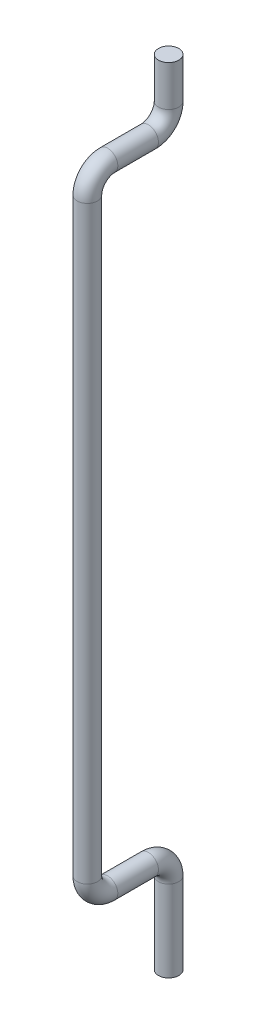
ISO-10303-21;
HEADER;
FILE_DESCRIPTION(('STEP AP214'),'2;1');
FILE_NAME('part.step','',(''),(''),'','','');
FILE_SCHEMA(('AUTOMOTIVE_DESIGN { 1 0 10303 214 1 1 1 1 }'));
ENDSEC;
DATA;
#1=APPLICATION_CONTEXT('core data for automotive mechanical design processes');
#2=APPLICATION_PROTOCOL_DEFINITION('international standard','automotive_design',2000,#1);
#3=PRODUCT_CONTEXT('',#1,'mechanical');
#4=PRODUCT('Part','Part','',(#3));
#5=PRODUCT_RELATED_PRODUCT_CATEGORY('part','',(#4));
#6=PRODUCT_DEFINITION_FORMATION('','',#4);
#7=PRODUCT_DEFINITION_CONTEXT('part definition',#1,'design');
#8=PRODUCT_DEFINITION('design','',#6,#7);
#9=PRODUCT_DEFINITION_SHAPE('','',#8);
#10=(LENGTH_UNIT() NAMED_UNIT(*) SI_UNIT(.MILLI.,.METRE.));
#11=(NAMED_UNIT(*) PLANE_ANGLE_UNIT() SI_UNIT($,.RADIAN.));
#12=(NAMED_UNIT(*) SI_UNIT($,.STERADIAN.) SOLID_ANGLE_UNIT());
#13=UNCERTAINTY_MEASURE_WITH_UNIT(LENGTH_MEASURE(1.E-05),#10,'distance_accuracy_value','');
#14=(GEOMETRIC_REPRESENTATION_CONTEXT(3) GLOBAL_UNCERTAINTY_ASSIGNED_CONTEXT((#13)) GLOBAL_UNIT_ASSIGNED_CONTEXT((#10,
#11,#12)) REPRESENTATION_CONTEXT('',''));
#15=CARTESIAN_POINT('',(0.,0.,0.));
#16=DIRECTION('',(0.,0.,1.));
#17=DIRECTION('',(1.,0.,0.));
#18=AXIS2_PLACEMENT_3D('',#15,#16,#17);
#19=CARTESIAN_POINT('',(0.,35.,-13.22));
#20=DIRECTION('',(0.,1.,0.));
#21=DIRECTION('',(0.,0.,1.));
#22=AXIS2_PLACEMENT_3D('',#19,#20,#21);
#23=CYLINDRICAL_SURFACE('',#22,0.5);
#24=CARTESIAN_POINT('',(0.,35.,-13.22));
#25=DIRECTION('',(0.,1.,0.));
#26=DIRECTION('',(0.,0.,1.));
#27=AXIS2_PLACEMENT_3D('',#24,#25,#26);
#28=CIRCLE('',#27,0.5);
#29=CARTESIAN_POINT('',(0.,35.,-13.72));
#30=VERTEX_POINT('',#29);
#31=EDGE_CURVE('E36',#30,#30,#28,.T.);
#32=ORIENTED_EDGE('',*,*,#31,.T.);
#33=EDGE_LOOP('',(#32));
#34=FACE_BOUND('',#33,.T.);
#35=CARTESIAN_POINT('',(0.,37.,-13.22));
#36=DIRECTION('',(0.,1.,0.));
#37=DIRECTION('',(0.,0.,1.));
#38=AXIS2_PLACEMENT_3D('',#35,#36,#37);
#39=CIRCLE('',#38,0.5);
#40=CARTESIAN_POINT('',(0.,37.,-12.72));
#41=VERTEX_POINT('',#40);
#42=EDGE_CURVE('E10',#41,#41,#39,.T.);
#43=ORIENTED_EDGE('',*,*,#42,.F.);
#44=EDGE_LOOP('',(#43));
#45=FACE_BOUND('',#44,.T.);
#46=ADVANCED_FACE('F30',(#34,#45),#23,.T.);
#47=CARTESIAN_POINT('',(0.,35.,-12.22));
#48=DIRECTION('',(1.,0.,0.));
#49=DIRECTION('',(0.,0.,-1.));
#50=AXIS2_PLACEMENT_3D('',#47,#48,#49);
#51=TOROIDAL_SURFACE('',#50,1.00000000000001,0.5);
#52=CARTESIAN_POINT('',(0.,34.,-12.22));
#53=DIRECTION('',(0.,0.,-1.));
#54=DIRECTION('',(0.,1.,0.));
#55=AXIS2_PLACEMENT_3D('',#52,#53,#54);
#56=CIRCLE('',#55,0.5);
#57=CARTESIAN_POINT('',(0.,33.5,-12.22));
#58=VERTEX_POINT('',#57);
#59=EDGE_CURVE('E40',#58,#58,#56,.T.);
#60=CARTESIAN_POINT('',(0.,35.,-12.22));
#61=DIRECTION('',(1.,0.,0.));
#62=DIRECTION('',(0.,0.,-1.));
#63=AXIS2_PLACEMENT_3D('',#60,#61,#62);
#64=CIRCLE('',#63,1.50000000000001);
#65=EDGE_CURVE('',#58,#30,#64,.T.);
#66=ORIENTED_EDGE('',*,*,#59,.T.);
#67=ORIENTED_EDGE('',*,*,#31,.F.);
#68=ORIENTED_EDGE('',*,*,#65,.T.);
#69=ORIENTED_EDGE('',*,*,#65,.F.);
#70=EDGE_LOOP('',(#66,#68,#67,#69));
#71=FACE_BOUND('',#70,.T.);
#72=ADVANCED_FACE('F86',(#71),#51,.T.);
#73=CARTESIAN_POINT('',(0.,34.,-10.22));
#74=DIRECTION('',(0.,0.,-1.));
#75=DIRECTION('',(-1.,0.,0.));
#76=AXIS2_PLACEMENT_3D('',#73,#74,#75);
#77=CYLINDRICAL_SURFACE('',#76,0.5);
#78=CARTESIAN_POINT('',(0.,34.,-10.22));
#79=DIRECTION('',(0.,0.,-1.));
#80=DIRECTION('',(0.,1.,0.));
#81=AXIS2_PLACEMENT_3D('',#78,#79,#80);
#82=CIRCLE('',#81,0.5);
#83=CARTESIAN_POINT('',(0.,34.5,-10.22));
#84=VERTEX_POINT('',#83);
#85=EDGE_CURVE('E44',#84,#84,#82,.T.);
#86=ORIENTED_EDGE('',*,*,#85,.T.);
#87=EDGE_LOOP('',(#86));
#88=FACE_BOUND('',#87,.T.);
#89=ORIENTED_EDGE('',*,*,#59,.F.);
#90=EDGE_LOOP('',(#89));
#91=FACE_BOUND('',#90,.T.);
#92=ADVANCED_FACE('F90',(#88,#91),#77,.T.);
#93=CARTESIAN_POINT('',(0.,33.,-10.22));
#94=DIRECTION('',(-1.,0.,0.));
#95=DIRECTION('',(0.,0.,1.));
#96=AXIS2_PLACEMENT_3D('',#93,#94,#95);
#97=TOROIDAL_SURFACE('',#96,0.999999999999999,0.5);
#98=CARTESIAN_POINT('',(0.,33.,-9.22));
#99=DIRECTION('',(0.,1.,0.));
#100=DIRECTION('',(0.,0.,1.));
#101=AXIS2_PLACEMENT_3D('',#98,#99,#100);
#102=CIRCLE('',#101,0.5);
#103=CARTESIAN_POINT('',(0.,33.,-8.72));
#104=VERTEX_POINT('',#103);
#105=EDGE_CURVE('E49',#104,#104,#102,.T.);
#106=CARTESIAN_POINT('',(0.,33.,-10.22));
#107=DIRECTION('',(-1.,0.,0.));
#108=DIRECTION('',(0.,0.,1.));
#109=AXIS2_PLACEMENT_3D('',#106,#107,#108);
#110=CIRCLE('',#109,1.5);
#111=EDGE_CURVE('',#104,#84,#110,.T.);
#112=ORIENTED_EDGE('',*,*,#105,.T.);
#113=ORIENTED_EDGE('',*,*,#85,.F.);
#114=ORIENTED_EDGE('',*,*,#111,.T.);
#115=ORIENTED_EDGE('',*,*,#111,.F.);
#116=EDGE_LOOP('',(#112,#114,#113,#115));
#117=FACE_BOUND('',#116,.T.);
#118=ADVANCED_FACE('F96',(#117),#97,.T.);
#119=CARTESIAN_POINT('',(0.,4.00000000000001,-9.22));
#120=DIRECTION('',(0.,1.,0.));
#121=DIRECTION('',(0.,0.,1.));
#122=AXIS2_PLACEMENT_3D('',#119,#120,#121);
#123=CYLINDRICAL_SURFACE('',#122,0.5);
#124=CARTESIAN_POINT('',(0.,4.00000000000001,-9.22));
#125=DIRECTION('',(0.,1.,0.));
#126=DIRECTION('',(0.,0.,1.));
#127=AXIS2_PLACEMENT_3D('',#124,#125,#126);
#128=CIRCLE('',#127,0.5);
#129=CARTESIAN_POINT('',(0.,4.00000000000001,-8.72));
#130=VERTEX_POINT('',#129);
#131=EDGE_CURVE('E52',#130,#130,#128,.T.);
#132=ORIENTED_EDGE('',*,*,#131,.T.);
#133=EDGE_LOOP('',(#132));
#134=FACE_BOUND('',#133,.T.);
#135=ORIENTED_EDGE('',*,*,#105,.F.);
#136=EDGE_LOOP('',(#135));
#137=FACE_BOUND('',#136,.T.);
#138=ADVANCED_FACE('F103',(#134,#137),#123,.T.);
#139=CARTESIAN_POINT('',(0.,4.,-10.22));
#140=DIRECTION('',(-1.,0.,0.));
#141=DIRECTION('',(0.,0.,1.));
#142=AXIS2_PLACEMENT_3D('',#139,#140,#141);
#143=TOROIDAL_SURFACE('',#142,1.,0.5);
#144=CARTESIAN_POINT('',(0.,3.,-10.22));
#145=DIRECTION('',(0.,0.,1.));
#146=DIRECTION('',(0.,-1.,0.));
#147=AXIS2_PLACEMENT_3D('',#144,#145,#146);
#148=CIRCLE('',#147,0.5);
#149=CARTESIAN_POINT('',(0.,2.5,-10.22));
#150=VERTEX_POINT('',#149);
#151=EDGE_CURVE('E55',#150,#150,#148,.T.);
#152=CARTESIAN_POINT('',(0.,4.,-10.22));
#153=DIRECTION('',(-1.,0.,0.));
#154=DIRECTION('',(0.,0.,1.));
#155=AXIS2_PLACEMENT_3D('',#152,#153,#154);
#156=CIRCLE('',#155,1.5);
#157=EDGE_CURVE('',#150,#130,#156,.T.);
#158=ORIENTED_EDGE('',*,*,#151,.T.);
#159=ORIENTED_EDGE('',*,*,#131,.F.);
#160=ORIENTED_EDGE('',*,*,#157,.T.);
#161=ORIENTED_EDGE('',*,*,#157,.F.);
#162=EDGE_LOOP('',(#158,#160,#159,#161));
#163=FACE_BOUND('',#162,.T.);
#164=ADVANCED_FACE('F107',(#163),#143,.T.);
#165=CARTESIAN_POINT('',(0.,3.,-12.22));
#166=DIRECTION('',(0.,0.,1.));
#167=DIRECTION('',(0.,-1.,0.));
#168=AXIS2_PLACEMENT_3D('',#165,#166,#167);
#169=CYLINDRICAL_SURFACE('',#168,0.5);
#170=CARTESIAN_POINT('',(0.,3.,-12.22));
#171=DIRECTION('',(0.,0.,1.));
#172=DIRECTION('',(0.,-1.,0.));
#173=AXIS2_PLACEMENT_3D('',#170,#171,#172);
#174=CIRCLE('',#173,0.5);
#175=CARTESIAN_POINT('',(0.,3.5,-12.22));
#176=VERTEX_POINT('',#175);
#177=EDGE_CURVE('E58',#176,#176,#174,.T.);
#178=ORIENTED_EDGE('',*,*,#177,.T.);
#179=EDGE_LOOP('',(#178));
#180=FACE_BOUND('',#179,.T.);
#181=ORIENTED_EDGE('',*,*,#151,.F.);
#182=EDGE_LOOP('',(#181));
#183=FACE_BOUND('',#182,.T.);
#184=ADVANCED_FACE('F111',(#180,#183),#169,.T.);
#185=CARTESIAN_POINT('',(0.,2.,-12.22));
#186=DIRECTION('',(1.,0.,0.));
#187=DIRECTION('',(0.,0.,-1.));
#188=AXIS2_PLACEMENT_3D('',#185,#186,#187);
#189=TOROIDAL_SURFACE('',#188,0.999999999999999,0.5);
#190=CARTESIAN_POINT('',(0.,2.,-13.22));
#191=DIRECTION('',(0.,1.,0.));
#192=DIRECTION('',(0.,0.,1.));
#193=AXIS2_PLACEMENT_3D('',#190,#191,#192);
#194=CIRCLE('',#193,0.5);
#195=CARTESIAN_POINT('',(0.,1.99999999999999,-13.72));
#196=VERTEX_POINT('',#195);
#197=EDGE_CURVE('E61',#196,#196,#194,.T.);
#198=CARTESIAN_POINT('',(0.,2.,-12.22));
#199=DIRECTION('',(1.,0.,0.));
#200=DIRECTION('',(0.,0.,-1.));
#201=AXIS2_PLACEMENT_3D('',#198,#199,#200);
#202=CIRCLE('',#201,1.5);
#203=EDGE_CURVE('',#196,#176,#202,.T.);
#204=ORIENTED_EDGE('',*,*,#197,.T.);
#205=ORIENTED_EDGE('',*,*,#177,.F.);
#206=ORIENTED_EDGE('',*,*,#203,.T.);
#207=ORIENTED_EDGE('',*,*,#203,.F.);
#208=EDGE_LOOP('',(#204,#206,#205,#207));
#209=FACE_BOUND('',#208,.T.);
#210=ADVANCED_FACE('F68',(#209),#189,.T.);
#211=CARTESIAN_POINT('',(0.,2.,-13.22));
#212=DIRECTION('',(0.,-1.,0.));
#213=DIRECTION('',(0.,0.,-1.));
#214=AXIS2_PLACEMENT_3D('',#211,#212,#213);
#215=CYLINDRICAL_SURFACE('',#214,0.5);
#216=ORIENTED_EDGE('',*,*,#197,.F.);
#217=EDGE_LOOP('',(#216));
#218=FACE_BOUND('',#217,.T.);
#219=CARTESIAN_POINT('',(0.,-2.,-13.22));
#220=DIRECTION('',(0.,1.,0.));
#221=DIRECTION('',(0.,0.,1.));
#222=AXIS2_PLACEMENT_3D('',#219,#220,#221);
#223=CIRCLE('',#222,0.5);
#224=CARTESIAN_POINT('',(0.,-2.,-12.72));
#225=VERTEX_POINT('',#224);
#226=EDGE_CURVE('E62',#225,#225,#223,.T.);
#227=ORIENTED_EDGE('',*,*,#226,.T.);
#228=EDGE_LOOP('',(#227));
#229=FACE_BOUND('',#228,.T.);
#230=ADVANCED_FACE('F71',(#218,#229),#215,.T.);
#231=CARTESIAN_POINT('',(0.,37.,-13.22));
#232=DIRECTION('',(0.,1.,0.));
#233=DIRECTION('',(0.,0.,1.));
#234=AXIS2_PLACEMENT_3D('',#231,#232,#233);
#235=PLANE('',#234);
#236=ORIENTED_EDGE('',*,*,#42,.T.);
#237=EDGE_LOOP('',(#236));
#238=FACE_BOUND('',#237,.T.);
#239=ADVANCED_FACE('F74',(#238),#235,.T.);
#240=CARTESIAN_POINT('',(0.,-2.,-13.22));
#241=DIRECTION('',(0.,1.,0.));
#242=DIRECTION('',(0.,0.,1.));
#243=AXIS2_PLACEMENT_3D('',#240,#241,#242);
#244=PLANE('',#243);
#245=ORIENTED_EDGE('',*,*,#226,.F.);
#246=EDGE_LOOP('',(#245));
#247=FACE_BOUND('',#246,.T.);
#248=ADVANCED_FACE('F78',(#247),#244,.F.);
#249=CLOSED_SHELL('',(#46,#72,#92,#118,#138,#164,#184,#210,#230,#239,#248));
#250=MANIFOLD_SOLID_BREP('B2',#249);
#251=ADVANCED_BREP_SHAPE_REPRESENTATION('',(#18,#250),#14);
#252=SHAPE_DEFINITION_REPRESENTATION(#9,#251);
ENDSEC;
END-ISO-10303-21;
